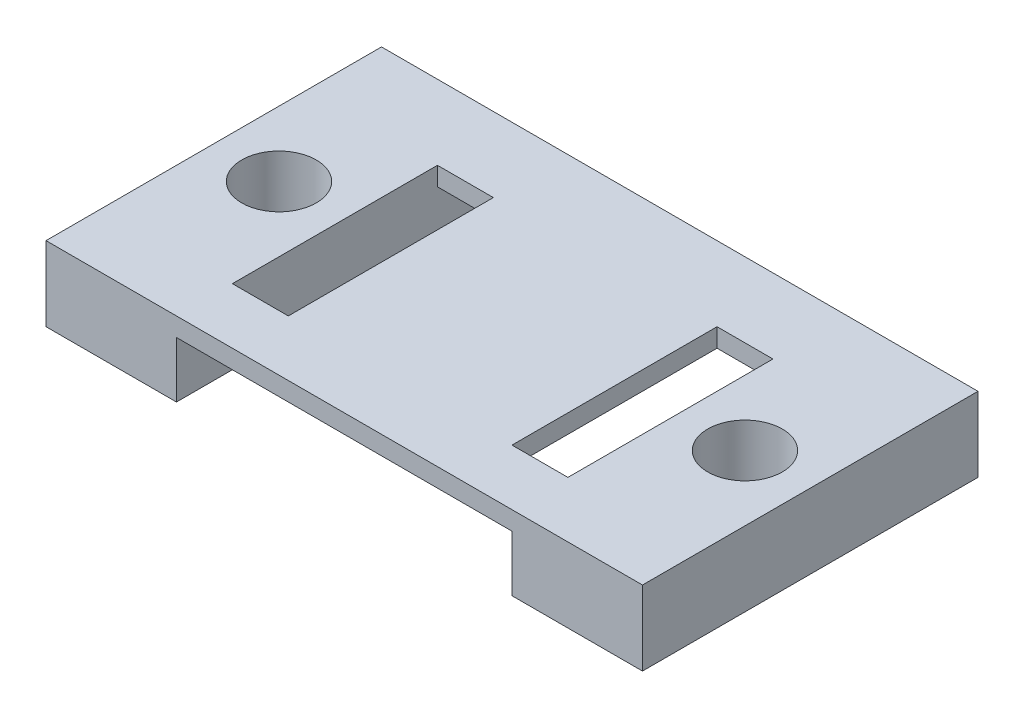
ISO-10303-21;
HEADER;
FILE_DESCRIPTION(('STEP AP214'),'2;1');
FILE_NAME('part.step','',(''),(''),'','','');
FILE_SCHEMA(('AUTOMOTIVE_DESIGN { 1 0 10303 214 1 1 1 1 }'));
ENDSEC;
DATA;
#1=APPLICATION_CONTEXT('core data for automotive mechanical design processes');
#2=APPLICATION_PROTOCOL_DEFINITION('international standard','automotive_design',2000,#1);
#3=PRODUCT_CONTEXT('',#1,'mechanical');
#4=PRODUCT('Part','Part','',(#3));
#5=PRODUCT_RELATED_PRODUCT_CATEGORY('part','',(#4));
#6=PRODUCT_DEFINITION_FORMATION('','',#4);
#7=PRODUCT_DEFINITION_CONTEXT('part definition',#1,'design');
#8=PRODUCT_DEFINITION('design','',#6,#7);
#9=PRODUCT_DEFINITION_SHAPE('','',#8);
#10=(LENGTH_UNIT() NAMED_UNIT(*) SI_UNIT(.MILLI.,.METRE.));
#11=(NAMED_UNIT(*) PLANE_ANGLE_UNIT() SI_UNIT($,.RADIAN.));
#12=(NAMED_UNIT(*) SI_UNIT($,.STERADIAN.) SOLID_ANGLE_UNIT());
#13=UNCERTAINTY_MEASURE_WITH_UNIT(LENGTH_MEASURE(1.E-05),#10,'distance_accuracy_value','');
#14=(GEOMETRIC_REPRESENTATION_CONTEXT(3) GLOBAL_UNCERTAINTY_ASSIGNED_CONTEXT((#13)) GLOBAL_UNIT_ASSIGNED_CONTEXT((#10,
#11,#12)) REPRESENTATION_CONTEXT('',''));
#15=CARTESIAN_POINT('',(0.,0.,0.));
#16=DIRECTION('',(0.,0.,1.));
#17=DIRECTION('',(1.,0.,0.));
#18=AXIS2_PLACEMENT_3D('',#15,#16,#17);
#19=CARTESIAN_POINT('',(-9.,1.,0.));
#20=DIRECTION('',(0.,0.,-1.));
#21=DIRECTION('',(-1.,0.,0.));
#22=AXIS2_PLACEMENT_3D('',#19,#20,#21);
#23=PLANE('',#22);
#24=DIRECTION('',(1.,0.,0.));
#25=VECTOR('',#24,1.);
#26=CARTESIAN_POINT('',(-9.,0.,0.));
#27=LINE('',#26,#25);
#28=CARTESIAN_POINT('',(-9.,0.,0.));
#29=VERTEX_POINT('',#28);
#30=CARTESIAN_POINT('',(9.,0.,0.));
#31=VERTEX_POINT('',#30);
#32=EDGE_CURVE('E149',#29,#31,#27,.T.);
#33=ORIENTED_EDGE('',*,*,#32,.T.);
#34=DIRECTION('',(0.,1.,0.));
#35=VECTOR('',#34,1.);
#36=CARTESIAN_POINT('',(9.,-3.,0.));
#37=LINE('',#36,#35);
#38=CARTESIAN_POINT('',(9.,-3.,0.));
#39=VERTEX_POINT('',#38);
#40=EDGE_CURVE('E289',#39,#31,#37,.T.);
#41=ORIENTED_EDGE('',*,*,#40,.F.);
#42=DIRECTION('',(1.,0.,0.));
#43=VECTOR('',#42,1.);
#44=CARTESIAN_POINT('',(9.,-3.,0.));
#45=LINE('',#44,#43);
#46=CARTESIAN_POINT('',(16.,-3.,0.));
#47=VERTEX_POINT('',#46);
#48=EDGE_CURVE('E285',#39,#47,#45,.T.);
#49=ORIENTED_EDGE('',*,*,#48,.T.);
#50=DIRECTION('',(0.,1.,0.));
#51=VECTOR('',#50,1.);
#52=CARTESIAN_POINT('',(16.,-3.,0.));
#53=LINE('',#52,#51);
#54=CARTESIAN_POINT('',(16.,1.,0.));
#55=VERTEX_POINT('',#54);
#56=EDGE_CURVE('E276',#47,#55,#53,.T.);
#57=ORIENTED_EDGE('',*,*,#56,.T.);
#58=DIRECTION('',(1.,0.,0.));
#59=VECTOR('',#58,1.);
#60=CARTESIAN_POINT('',(-9.,1.,0.));
#61=LINE('',#60,#59);
#62=CARTESIAN_POINT('',(-16.,1.,0.));
#63=VERTEX_POINT('',#62);
#64=EDGE_CURVE('E183',#63,#55,#61,.T.);
#65=ORIENTED_EDGE('',*,*,#64,.F.);
#66=DIRECTION('',(0.,1.,0.));
#67=VECTOR('',#66,1.);
#68=CARTESIAN_POINT('',(-16.,-3.,0.));
#69=LINE('',#68,#67);
#70=CARTESIAN_POINT('',(-16.,-3.,0.));
#71=VERTEX_POINT('',#70);
#72=EDGE_CURVE('E238',#71,#63,#69,.T.);
#73=ORIENTED_EDGE('',*,*,#72,.F.);
#74=DIRECTION('',(1.,0.,0.));
#75=VECTOR('',#74,1.);
#76=CARTESIAN_POINT('',(-9.,-3.,0.));
#77=LINE('',#76,#75);
#78=CARTESIAN_POINT('',(-9.,-3.,0.));
#79=VERTEX_POINT('',#78);
#80=EDGE_CURVE('E261',#71,#79,#77,.T.);
#81=ORIENTED_EDGE('',*,*,#80,.T.);
#82=DIRECTION('',(0.,1.,0.));
#83=VECTOR('',#82,1.);
#84=CARTESIAN_POINT('',(-9.,-3.,0.));
#85=LINE('',#84,#83);
#86=EDGE_CURVE('E243',#79,#29,#85,.T.);
#87=ORIENTED_EDGE('',*,*,#86,.T.);
#88=EDGE_LOOP('',(#33,#41,#49,#57,#65,#73,#81,#87));
#89=FACE_BOUND('',#88,.T.);
#90=ADVANCED_FACE('F39',(#89),#23,.F.);
#91=CARTESIAN_POINT('',(9.,1.,-3.));
#92=DIRECTION('',(0.,0.,1.));
#93=DIRECTION('',(1.,0.,0.));
#94=AXIS2_PLACEMENT_3D('',#91,#92,#93);
#95=PLANE('',#94);
#96=DIRECTION('',(-1.,0.,0.));
#97=VECTOR('',#96,1.);
#98=CARTESIAN_POINT('',(9.,0.,-3.));
#99=LINE('',#98,#97);
#100=CARTESIAN_POINT('',(9.,0.,-3.));
#101=VERTEX_POINT('',#100);
#102=CARTESIAN_POINT('',(6.,0.,-3.));
#103=VERTEX_POINT('',#102);
#104=EDGE_CURVE('E157',#101,#103,#99,.T.);
#105=ORIENTED_EDGE('',*,*,#104,.T.);
#106=DIRECTION('',(0.,-1.,0.));
#107=VECTOR('',#106,1.);
#108=CARTESIAN_POINT('',(6.,1.,-3.));
#109=LINE('',#108,#107);
#110=CARTESIAN_POINT('',(6.,1.,-3.));
#111=VERTEX_POINT('',#110);
#112=EDGE_CURVE('E48',#111,#103,#109,.T.);
#113=ORIENTED_EDGE('',*,*,#112,.F.);
#114=DIRECTION('',(-1.,0.,0.));
#115=VECTOR('',#114,1.);
#116=CARTESIAN_POINT('',(9.,1.,-3.));
#117=LINE('',#116,#115);
#118=CARTESIAN_POINT('',(9.,1.,-3.));
#119=VERTEX_POINT('',#118);
#120=EDGE_CURVE('E100',#119,#111,#117,.T.);
#121=ORIENTED_EDGE('',*,*,#120,.F.);
#122=DIRECTION('',(0.,-1.,0.));
#123=VECTOR('',#122,1.);
#124=CARTESIAN_POINT('',(9.,1.,-3.));
#125=LINE('',#124,#123);
#126=EDGE_CURVE('E11',#119,#101,#125,.T.);
#127=ORIENTED_EDGE('',*,*,#126,.T.);
#128=EDGE_LOOP('',(#105,#113,#121,#127));
#129=FACE_BOUND('',#128,.T.);
#130=ADVANCED_FACE('F351',(#129),#95,.F.);
#131=CARTESIAN_POINT('',(6.,1.,-3.));
#132=DIRECTION('',(-1.,0.,0.));
#133=DIRECTION('',(0.,0.,1.));
#134=AXIS2_PLACEMENT_3D('',#131,#132,#133);
#135=PLANE('',#134);
#136=DIRECTION('',(0.,0.,-1.));
#137=VECTOR('',#136,1.);
#138=CARTESIAN_POINT('',(6.,0.,-3.));
#139=LINE('',#138,#137);
#140=CARTESIAN_POINT('',(6.,0.,-14.));
#141=VERTEX_POINT('',#140);
#142=EDGE_CURVE('E160',#103,#141,#139,.T.);
#143=ORIENTED_EDGE('',*,*,#142,.T.);
#144=DIRECTION('',(0.,-1.,0.));
#145=VECTOR('',#144,1.);
#146=CARTESIAN_POINT('',(6.,1.,-14.));
#147=LINE('',#146,#145);
#148=CARTESIAN_POINT('',(6.,1.,-14.));
#149=VERTEX_POINT('',#148);
#150=EDGE_CURVE('E195',#149,#141,#147,.T.);
#151=ORIENTED_EDGE('',*,*,#150,.F.);
#152=DIRECTION('',(0.,0.,-1.));
#153=VECTOR('',#152,1.);
#154=CARTESIAN_POINT('',(6.,1.,-3.));
#155=LINE('',#154,#153);
#156=EDGE_CURVE('E205',#111,#149,#155,.T.);
#157=ORIENTED_EDGE('',*,*,#156,.F.);
#158=ORIENTED_EDGE('',*,*,#112,.T.);
#159=EDGE_LOOP('',(#143,#151,#157,#158));
#160=FACE_BOUND('',#159,.T.);
#161=ADVANCED_FACE('F203',(#160),#135,.F.);
#162=CARTESIAN_POINT('',(6.,1.,-14.));
#163=DIRECTION('',(0.,0.,-1.));
#164=DIRECTION('',(-1.,0.,0.));
#165=AXIS2_PLACEMENT_3D('',#162,#163,#164);
#166=PLANE('',#165);
#167=DIRECTION('',(1.,0.,0.));
#168=VECTOR('',#167,1.);
#169=CARTESIAN_POINT('',(6.,0.,-14.));
#170=LINE('',#169,#168);
#171=CARTESIAN_POINT('',(9.,0.,-14.));
#172=VERTEX_POINT('',#171);
#173=EDGE_CURVE('E163',#141,#172,#170,.T.);
#174=ORIENTED_EDGE('',*,*,#173,.T.);
#175=DIRECTION('',(0.,-1.,0.));
#176=VECTOR('',#175,1.);
#177=CARTESIAN_POINT('',(9.,1.,-14.));
#178=LINE('',#177,#176);
#179=CARTESIAN_POINT('',(9.,1.,-14.));
#180=VERTEX_POINT('',#179);
#181=EDGE_CURVE('E191',#180,#172,#178,.T.);
#182=ORIENTED_EDGE('',*,*,#181,.F.);
#183=DIRECTION('',(1.,0.,0.));
#184=VECTOR('',#183,1.);
#185=CARTESIAN_POINT('',(6.,1.,-14.));
#186=LINE('',#185,#184);
#187=EDGE_CURVE('E219',#149,#180,#186,.T.);
#188=ORIENTED_EDGE('',*,*,#187,.F.);
#189=ORIENTED_EDGE('',*,*,#150,.T.);
#190=EDGE_LOOP('',(#174,#182,#188,#189));
#191=FACE_BOUND('',#190,.T.);
#192=ADVANCED_FACE('F216',(#191),#166,.F.);
#193=CARTESIAN_POINT('',(9.,1.,-18.));
#194=DIRECTION('',(0.,0.,1.));
#195=DIRECTION('',(1.,0.,0.));
#196=AXIS2_PLACEMENT_3D('',#193,#194,#195);
#197=PLANE('',#196);
#198=DIRECTION('',(-1.,0.,0.));
#199=VECTOR('',#198,1.);
#200=CARTESIAN_POINT('',(9.,0.,-18.));
#201=LINE('',#200,#199);
#202=CARTESIAN_POINT('',(9.,0.,-18.));
#203=VERTEX_POINT('',#202);
#204=CARTESIAN_POINT('',(-9.,0.,-18.));
#205=VERTEX_POINT('',#204);
#206=EDGE_CURVE('E170',#203,#205,#201,.T.);
#207=ORIENTED_EDGE('',*,*,#206,.T.);
#208=DIRECTION('',(0.,1.,0.));
#209=VECTOR('',#208,1.);
#210=CARTESIAN_POINT('',(-9.,-3.,-18.));
#211=LINE('',#210,#209);
#212=CARTESIAN_POINT('',(-9.,-3.,-18.));
#213=VERTEX_POINT('',#212);
#214=EDGE_CURVE('E150',#213,#205,#211,.T.);
#215=ORIENTED_EDGE('',*,*,#214,.F.);
#216=DIRECTION('',(-1.,0.,0.));
#217=VECTOR('',#216,1.);
#218=CARTESIAN_POINT('',(-16.,-3.,-18.));
#219=LINE('',#218,#217);
#220=CARTESIAN_POINT('',(-16.,-3.,-18.));
#221=VERTEX_POINT('',#220);
#222=EDGE_CURVE('E252',#213,#221,#219,.T.);
#223=ORIENTED_EDGE('',*,*,#222,.T.);
#224=DIRECTION('',(0.,1.,0.));
#225=VECTOR('',#224,1.);
#226=CARTESIAN_POINT('',(-16.,-3.,-18.));
#227=LINE('',#226,#225);
#228=CARTESIAN_POINT('',(-16.,1.,-18.));
#229=VERTEX_POINT('',#228);
#230=EDGE_CURVE('E234',#221,#229,#227,.T.);
#231=ORIENTED_EDGE('',*,*,#230,.T.);
#232=DIRECTION('',(-1.,0.,0.));
#233=VECTOR('',#232,1.);
#234=CARTESIAN_POINT('',(9.,1.,-18.));
#235=LINE('',#234,#233);
#236=CARTESIAN_POINT('',(16.,1.,-18.));
#237=VERTEX_POINT('',#236);
#238=EDGE_CURVE('E127',#237,#229,#235,.T.);
#239=ORIENTED_EDGE('',*,*,#238,.F.);
#240=DIRECTION('',(0.,1.,0.));
#241=VECTOR('',#240,1.);
#242=CARTESIAN_POINT('',(16.,-3.,-18.));
#243=LINE('',#242,#241);
#244=CARTESIAN_POINT('',(16.,-3.,-18.));
#245=VERTEX_POINT('',#244);
#246=EDGE_CURVE('E280',#245,#237,#243,.T.);
#247=ORIENTED_EDGE('',*,*,#246,.F.);
#248=DIRECTION('',(-1.,0.,0.));
#249=VECTOR('',#248,1.);
#250=CARTESIAN_POINT('',(16.,-3.,-18.));
#251=LINE('',#250,#249);
#252=CARTESIAN_POINT('',(9.,-3.,-18.));
#253=VERTEX_POINT('',#252);
#254=EDGE_CURVE('E312',#245,#253,#251,.T.);
#255=ORIENTED_EDGE('',*,*,#254,.T.);
#256=DIRECTION('',(0.,1.,0.));
#257=VECTOR('',#256,1.);
#258=CARTESIAN_POINT('',(9.,-3.,-18.));
#259=LINE('',#258,#257);
#260=EDGE_CURVE('E284',#253,#203,#259,.T.);
#261=ORIENTED_EDGE('',*,*,#260,.T.);
#262=EDGE_LOOP('',(#207,#215,#223,#231,#239,#247,#255,#261));
#263=FACE_BOUND('',#262,.T.);
#264=ADVANCED_FACE('F407',(#263),#197,.F.);
#265=CARTESIAN_POINT('',(-9.,1.,-14.));
#266=DIRECTION('',(0.,0.,-1.));
#267=DIRECTION('',(-1.,0.,0.));
#268=AXIS2_PLACEMENT_3D('',#265,#266,#267);
#269=PLANE('',#268);
#270=DIRECTION('',(1.,0.,0.));
#271=VECTOR('',#270,1.);
#272=CARTESIAN_POINT('',(-9.,0.,-14.));
#273=LINE('',#272,#271);
#274=CARTESIAN_POINT('',(-9.,0.,-14.));
#275=VERTEX_POINT('',#274);
#276=CARTESIAN_POINT('',(-6.,0.,-14.));
#277=VERTEX_POINT('',#276);
#278=EDGE_CURVE('E132',#275,#277,#273,.T.);
#279=ORIENTED_EDGE('',*,*,#278,.T.);
#280=DIRECTION('',(0.,-1.,0.));
#281=VECTOR('',#280,1.);
#282=CARTESIAN_POINT('',(-6.,1.,-14.));
#283=LINE('',#282,#281);
#284=CARTESIAN_POINT('',(-6.,1.,-14.));
#285=VERTEX_POINT('',#284);
#286=EDGE_CURVE('E129',#285,#277,#283,.T.);
#287=ORIENTED_EDGE('',*,*,#286,.F.);
#288=DIRECTION('',(1.,0.,0.));
#289=VECTOR('',#288,1.);
#290=CARTESIAN_POINT('',(-9.,1.,-14.));
#291=LINE('',#290,#289);
#292=CARTESIAN_POINT('',(-9.,1.,-14.));
#293=VERTEX_POINT('',#292);
#294=EDGE_CURVE('E115',#293,#285,#291,.T.);
#295=ORIENTED_EDGE('',*,*,#294,.F.);
#296=DIRECTION('',(0.,-1.,0.));
#297=VECTOR('',#296,1.);
#298=CARTESIAN_POINT('',(-9.,1.,-14.));
#299=LINE('',#298,#297);
#300=EDGE_CURVE('E134',#293,#275,#299,.T.);
#301=ORIENTED_EDGE('',*,*,#300,.T.);
#302=EDGE_LOOP('',(#279,#287,#295,#301));
#303=FACE_BOUND('',#302,.T.);
#304=ADVANCED_FACE('F130',(#303),#269,.F.);
#305=CARTESIAN_POINT('',(-6.,1.,-14.));
#306=DIRECTION('',(1.,0.,0.));
#307=DIRECTION('',(0.,0.,-1.));
#308=AXIS2_PLACEMENT_3D('',#305,#306,#307);
#309=PLANE('',#308);
#310=DIRECTION('',(0.,0.,1.));
#311=VECTOR('',#310,1.);
#312=CARTESIAN_POINT('',(-6.,0.,-14.));
#313=LINE('',#312,#311);
#314=CARTESIAN_POINT('',(-6.,0.,-3.));
#315=VERTEX_POINT('',#314);
#316=EDGE_CURVE('E86',#277,#315,#313,.T.);
#317=ORIENTED_EDGE('',*,*,#316,.T.);
#318=DIRECTION('',(0.,-1.,0.));
#319=VECTOR('',#318,1.);
#320=CARTESIAN_POINT('',(-6.,1.,-3.));
#321=LINE('',#320,#319);
#322=CARTESIAN_POINT('',(-6.,1.,-3.));
#323=VERTEX_POINT('',#322);
#324=EDGE_CURVE('E135',#323,#315,#321,.T.);
#325=ORIENTED_EDGE('',*,*,#324,.F.);
#326=DIRECTION('',(0.,0.,1.));
#327=VECTOR('',#326,1.);
#328=CARTESIAN_POINT('',(-6.,1.,-14.));
#329=LINE('',#328,#327);
#330=EDGE_CURVE('E120',#285,#323,#329,.T.);
#331=ORIENTED_EDGE('',*,*,#330,.F.);
#332=ORIENTED_EDGE('',*,*,#286,.T.);
#333=EDGE_LOOP('',(#317,#325,#331,#332));
#334=FACE_BOUND('',#333,.T.);
#335=ADVANCED_FACE('F137',(#334),#309,.F.);
#336=CARTESIAN_POINT('',(-6.,1.,-3.));
#337=DIRECTION('',(0.,0.,1.));
#338=DIRECTION('',(1.,0.,0.));
#339=AXIS2_PLACEMENT_3D('',#336,#337,#338);
#340=PLANE('',#339);
#341=DIRECTION('',(-1.,0.,0.));
#342=VECTOR('',#341,1.);
#343=CARTESIAN_POINT('',(-6.,0.,-3.));
#344=LINE('',#343,#342);
#345=CARTESIAN_POINT('',(-9.,0.,-3.));
#346=VERTEX_POINT('',#345);
#347=EDGE_CURVE('E92',#315,#346,#344,.T.);
#348=ORIENTED_EDGE('',*,*,#347,.T.);
#349=DIRECTION('',(0.,-1.,0.));
#350=VECTOR('',#349,1.);
#351=CARTESIAN_POINT('',(-9.,1.,-3.));
#352=LINE('',#351,#350);
#353=CARTESIAN_POINT('',(-9.,1.,-3.));
#354=VERTEX_POINT('',#353);
#355=EDGE_CURVE('E141',#354,#346,#352,.T.);
#356=ORIENTED_EDGE('',*,*,#355,.F.);
#357=DIRECTION('',(-1.,0.,0.));
#358=VECTOR('',#357,1.);
#359=CARTESIAN_POINT('',(-6.,1.,-3.));
#360=LINE('',#359,#358);
#361=EDGE_CURVE('E56',#323,#354,#360,.T.);
#362=ORIENTED_EDGE('',*,*,#361,.F.);
#363=ORIENTED_EDGE('',*,*,#324,.T.);
#364=EDGE_LOOP('',(#348,#356,#362,#363));
#365=FACE_BOUND('',#364,.T.);
#366=ADVANCED_FACE('F337',(#365),#340,.F.);
#367=CARTESIAN_POINT('',(0.,1.,0.));
#368=DIRECTION('',(0.,1.,0.));
#369=DIRECTION('',(0.,0.,1.));
#370=AXIS2_PLACEMENT_3D('',#367,#368,#369);
#371=PLANE('',#370);
#372=DIRECTION('',(0.,0.,-1.));
#373=VECTOR('',#372,1.);
#374=CARTESIAN_POINT('',(16.,1.,0.));
#375=LINE('',#374,#373);
#376=EDGE_CURVE('E300',#55,#237,#375,.T.);
#377=ORIENTED_EDGE('',*,*,#376,.T.);
#378=ORIENTED_EDGE('',*,*,#238,.T.);
#379=DIRECTION('',(0.,0.,1.));
#380=VECTOR('',#379,1.);
#381=CARTESIAN_POINT('',(-16.,1.,0.));
#382=LINE('',#381,#380);
#383=EDGE_CURVE('E253',#229,#63,#382,.T.);
#384=ORIENTED_EDGE('',*,*,#383,.T.);
#385=ORIENTED_EDGE('',*,*,#64,.T.);
#386=EDGE_LOOP('',(#377,#378,#384,#385));
#387=FACE_BOUND('',#386,.T.);
#388=ORIENTED_EDGE('',*,*,#187,.T.);
#389=DIRECTION('',(0.,0.,1.));
#390=VECTOR('',#389,1.);
#391=CARTESIAN_POINT('',(9.,1.,-18.));
#392=LINE('',#391,#390);
#393=EDGE_CURVE('E296',#180,#119,#392,.T.);
#394=ORIENTED_EDGE('',*,*,#393,.T.);
#395=ORIENTED_EDGE('',*,*,#120,.T.);
#396=ORIENTED_EDGE('',*,*,#156,.T.);
#397=EDGE_LOOP('',(#388,#394,#395,#396));
#398=FACE_BOUND('',#397,.T.);
#399=ORIENTED_EDGE('',*,*,#361,.T.);
#400=DIRECTION('',(0.,0.,-1.));
#401=VECTOR('',#400,1.);
#402=CARTESIAN_POINT('',(-9.,1.,-18.));
#403=LINE('',#402,#401);
#404=EDGE_CURVE('E122',#354,#293,#403,.T.);
#405=ORIENTED_EDGE('',*,*,#404,.T.);
#406=ORIENTED_EDGE('',*,*,#294,.T.);
#407=ORIENTED_EDGE('',*,*,#330,.T.);
#408=EDGE_LOOP('',(#399,#405,#406,#407));
#409=FACE_BOUND('',#408,.T.);
#410=CARTESIAN_POINT('',(-12.5,1.,-8.99999999999999));
#411=DIRECTION('',(0.,1.,0.));
#412=DIRECTION('',(0.,0.,1.));
#413=AXIS2_PLACEMENT_3D('',#410,#411,#412);
#414=CIRCLE('',#413,2.);
#415=CARTESIAN_POINT('',(-12.5,1.,-6.99999999999999));
#416=VERTEX_POINT('',#415);
#417=EDGE_CURVE('E272',#416,#416,#414,.T.);
#418=ORIENTED_EDGE('',*,*,#417,.F.);
#419=EDGE_LOOP('',(#418));
#420=FACE_BOUND('',#419,.T.);
#421=CARTESIAN_POINT('',(12.5,1.,-8.99999999999999));
#422=DIRECTION('',(0.,1.,0.));
#423=DIRECTION('',(0.,0.,-1.));
#424=AXIS2_PLACEMENT_3D('',#421,#422,#423);
#425=CIRCLE('',#424,2.);
#426=CARTESIAN_POINT('',(12.5,1.,-11.));
#427=VERTEX_POINT('',#426);
#428=EDGE_CURVE('E319',#427,#427,#425,.T.);
#429=ORIENTED_EDGE('',*,*,#428,.F.);
#430=EDGE_LOOP('',(#429));
#431=FACE_BOUND('',#430,.T.);
#432=ADVANCED_FACE('F117',(#387,#398,#409,#420,#431),#371,.T.);
#433=CARTESIAN_POINT('',(0.,0.,0.));
#434=DIRECTION('',(0.,1.,0.));
#435=DIRECTION('',(0.,0.,1.));
#436=AXIS2_PLACEMENT_3D('',#433,#434,#435);
#437=PLANE('',#436);
#438=DIRECTION('',(0.,0.,1.));
#439=VECTOR('',#438,1.);
#440=CARTESIAN_POINT('',(-9.,0.,-3.));
#441=LINE('',#440,#439);
#442=EDGE_CURVE('E145',#346,#29,#441,.T.);
#443=ORIENTED_EDGE('',*,*,#442,.F.);
#444=ORIENTED_EDGE('',*,*,#347,.F.);
#445=ORIENTED_EDGE('',*,*,#316,.F.);
#446=ORIENTED_EDGE('',*,*,#278,.F.);
#447=DIRECTION('',(0.,0.,1.));
#448=VECTOR('',#447,1.);
#449=CARTESIAN_POINT('',(-9.,0.,-18.));
#450=LINE('',#449,#448);
#451=EDGE_CURVE('E173',#205,#275,#450,.T.);
#452=ORIENTED_EDGE('',*,*,#451,.F.);
#453=ORIENTED_EDGE('',*,*,#206,.F.);
#454=DIRECTION('',(0.,0.,-1.));
#455=VECTOR('',#454,1.);
#456=CARTESIAN_POINT('',(9.,0.,-14.));
#457=LINE('',#456,#455);
#458=EDGE_CURVE('E166',#172,#203,#457,.T.);
#459=ORIENTED_EDGE('',*,*,#458,.F.);
#460=ORIENTED_EDGE('',*,*,#173,.F.);
#461=ORIENTED_EDGE('',*,*,#142,.F.);
#462=ORIENTED_EDGE('',*,*,#104,.F.);
#463=DIRECTION('',(0.,0.,-1.));
#464=VECTOR('',#463,1.);
#465=CARTESIAN_POINT('',(9.,0.,0.));
#466=LINE('',#465,#464);
#467=EDGE_CURVE('E153',#31,#101,#466,.T.);
#468=ORIENTED_EDGE('',*,*,#467,.F.);
#469=ORIENTED_EDGE('',*,*,#32,.F.);
#470=EDGE_LOOP('',(#443,#444,#445,#446,#452,#453,#459,#460,#461,#462,#468,#469));
#471=FACE_BOUND('',#470,.T.);
#472=ADVANCED_FACE('F209',(#471),#437,.F.);
#473=CARTESIAN_POINT('',(-9.,-3.,-18.));
#474=DIRECTION('',(1.,0.,0.));
#475=DIRECTION('',(0.,0.,-1.));
#476=AXIS2_PLACEMENT_3D('',#473,#474,#475);
#477=PLANE('',#476);
#478=ORIENTED_EDGE('',*,*,#355,.T.);
#479=ORIENTED_EDGE('',*,*,#442,.T.);
#480=ORIENTED_EDGE('',*,*,#86,.F.);
#481=DIRECTION('',(0.,0.,-1.));
#482=VECTOR('',#481,1.);
#483=CARTESIAN_POINT('',(-9.,-3.,-18.));
#484=LINE('',#483,#482);
#485=EDGE_CURVE('E239',#79,#213,#484,.T.);
#486=ORIENTED_EDGE('',*,*,#485,.T.);
#487=ORIENTED_EDGE('',*,*,#214,.T.);
#488=ORIENTED_EDGE('',*,*,#451,.T.);
#489=ORIENTED_EDGE('',*,*,#300,.F.);
#490=ORIENTED_EDGE('',*,*,#404,.F.);
#491=EDGE_LOOP('',(#478,#479,#480,#486,#487,#488,#489,#490));
#492=FACE_BOUND('',#491,.T.);
#493=ADVANCED_FACE('F345',(#492),#477,.T.);
#494=CARTESIAN_POINT('',(-16.,-3.,0.));
#495=DIRECTION('',(-1.,0.,0.));
#496=DIRECTION('',(0.,0.,1.));
#497=AXIS2_PLACEMENT_3D('',#494,#495,#496);
#498=PLANE('',#497);
#499=ORIENTED_EDGE('',*,*,#383,.F.);
#500=ORIENTED_EDGE('',*,*,#230,.F.);
#501=DIRECTION('',(0.,0.,1.));
#502=VECTOR('',#501,1.);
#503=CARTESIAN_POINT('',(-16.,-3.,0.));
#504=LINE('',#503,#502);
#505=EDGE_CURVE('E265',#221,#71,#504,.T.);
#506=ORIENTED_EDGE('',*,*,#505,.T.);
#507=ORIENTED_EDGE('',*,*,#72,.T.);
#508=EDGE_LOOP('',(#499,#500,#506,#507));
#509=FACE_BOUND('',#508,.T.);
#510=ADVANCED_FACE('F414',(#509),#498,.T.);
#511=CARTESIAN_POINT('',(0.,-3.,0.));
#512=DIRECTION('',(0.,-1.,0.));
#513=DIRECTION('',(0.,0.,-1.));
#514=AXIS2_PLACEMENT_3D('',#511,#512,#513);
#515=PLANE('',#514);
#516=CARTESIAN_POINT('',(-12.5,-3.,-8.99999999999999));
#517=DIRECTION('',(0.,1.,0.));
#518=DIRECTION('',(0.,0.,1.));
#519=AXIS2_PLACEMENT_3D('',#516,#517,#518);
#520=CIRCLE('',#519,2.);
#521=CARTESIAN_POINT('',(-12.5,-3.,-6.99999999999999));
#522=VERTEX_POINT('',#521);
#523=EDGE_CURVE('E257',#522,#522,#520,.T.);
#524=ORIENTED_EDGE('',*,*,#523,.T.);
#525=EDGE_LOOP('',(#524));
#526=FACE_BOUND('',#525,.T.);
#527=ORIENTED_EDGE('',*,*,#222,.F.);
#528=ORIENTED_EDGE('',*,*,#485,.F.);
#529=ORIENTED_EDGE('',*,*,#80,.F.);
#530=ORIENTED_EDGE('',*,*,#505,.F.);
#531=EDGE_LOOP('',(#527,#528,#529,#530));
#532=FACE_BOUND('',#531,.T.);
#533=ADVANCED_FACE('F410',(#526,#532),#515,.T.);
#534=CARTESIAN_POINT('',(-12.5,-3.,-8.99999999999999));
#535=DIRECTION('',(0.,1.,0.));
#536=DIRECTION('',(0.,0.,1.));
#537=AXIS2_PLACEMENT_3D('',#534,#535,#536);
#538=CYLINDRICAL_SURFACE('',#537,2.);
#539=ORIENTED_EDGE('',*,*,#523,.F.);
#540=EDGE_LOOP('',(#539));
#541=FACE_BOUND('',#540,.T.);
#542=ORIENTED_EDGE('',*,*,#417,.T.);
#543=EDGE_LOOP('',(#542));
#544=FACE_BOUND('',#543,.T.);
#545=ADVANCED_FACE('F425',(#541,#544),#538,.F.);
#546=CARTESIAN_POINT('',(9.,-3.,-18.));
#547=DIRECTION('',(-1.,0.,0.));
#548=DIRECTION('',(0.,0.,1.));
#549=AXIS2_PLACEMENT_3D('',#546,#547,#548);
#550=PLANE('',#549);
#551=ORIENTED_EDGE('',*,*,#181,.T.);
#552=ORIENTED_EDGE('',*,*,#458,.T.);
#553=ORIENTED_EDGE('',*,*,#260,.F.);
#554=DIRECTION('',(0.,0.,1.));
#555=VECTOR('',#554,1.);
#556=CARTESIAN_POINT('',(9.,-3.,-18.));
#557=LINE('',#556,#555);
#558=EDGE_CURVE('E308',#253,#39,#557,.T.);
#559=ORIENTED_EDGE('',*,*,#558,.T.);
#560=ORIENTED_EDGE('',*,*,#40,.T.);
#561=ORIENTED_EDGE('',*,*,#467,.T.);
#562=ORIENTED_EDGE('',*,*,#126,.F.);
#563=ORIENTED_EDGE('',*,*,#393,.F.);
#564=EDGE_LOOP('',(#551,#552,#553,#559,#560,#561,#562,#563));
#565=FACE_BOUND('',#564,.T.);
#566=ADVANCED_FACE('F363',(#565),#550,.T.);
#567=CARTESIAN_POINT('',(16.,-3.,0.));
#568=DIRECTION('',(1.,0.,0.));
#569=DIRECTION('',(0.,0.,-1.));
#570=AXIS2_PLACEMENT_3D('',#567,#568,#569);
#571=PLANE('',#570);
#572=ORIENTED_EDGE('',*,*,#376,.F.);
#573=ORIENTED_EDGE('',*,*,#56,.F.);
#574=DIRECTION('',(0.,0.,-1.));
#575=VECTOR('',#574,1.);
#576=CARTESIAN_POINT('',(16.,-3.,0.));
#577=LINE('',#576,#575);
#578=EDGE_CURVE('E299',#47,#245,#577,.T.);
#579=ORIENTED_EDGE('',*,*,#578,.T.);
#580=ORIENTED_EDGE('',*,*,#246,.T.);
#581=EDGE_LOOP('',(#572,#573,#579,#580));
#582=FACE_BOUND('',#581,.T.);
#583=ADVANCED_FACE('F416',(#582),#571,.T.);
#584=CARTESIAN_POINT('',(0.,-3.,0.));
#585=DIRECTION('',(0.,1.,0.));
#586=DIRECTION('',(0.,0.,1.));
#587=AXIS2_PLACEMENT_3D('',#584,#585,#586);
#588=PLANE('',#587);
#589=CARTESIAN_POINT('',(12.5,-3.,-8.99999999999999));
#590=DIRECTION('',(0.,1.,0.));
#591=DIRECTION('',(0.,0.,-1.));
#592=AXIS2_PLACEMENT_3D('',#589,#590,#591);
#593=CIRCLE('',#592,2.);
#594=CARTESIAN_POINT('',(12.5,-3.,-11.));
#595=VERTEX_POINT('',#594);
#596=EDGE_CURVE('E304',#595,#595,#593,.T.);
#597=ORIENTED_EDGE('',*,*,#596,.T.);
#598=EDGE_LOOP('',(#597));
#599=FACE_BOUND('',#598,.T.);
#600=ORIENTED_EDGE('',*,*,#578,.F.);
#601=ORIENTED_EDGE('',*,*,#48,.F.);
#602=ORIENTED_EDGE('',*,*,#558,.F.);
#603=ORIENTED_EDGE('',*,*,#254,.F.);
#604=EDGE_LOOP('',(#600,#601,#602,#603));
#605=FACE_BOUND('',#604,.T.);
#606=ADVANCED_FACE('F327',(#599,#605),#588,.F.);
#607=CARTESIAN_POINT('',(12.5,-3.,-8.99999999999999));
#608=DIRECTION('',(0.,1.,0.));
#609=DIRECTION('',(0.,0.,1.));
#610=AXIS2_PLACEMENT_3D('',#607,#608,#609);
#611=CYLINDRICAL_SURFACE('',#610,2.);
#612=ORIENTED_EDGE('',*,*,#596,.F.);
#613=EDGE_LOOP('',(#612));
#614=FACE_BOUND('',#613,.T.);
#615=ORIENTED_EDGE('',*,*,#428,.T.);
#616=EDGE_LOOP('',(#615));
#617=FACE_BOUND('',#616,.T.);
#618=ADVANCED_FACE('F330',(#614,#617),#611,.F.);
#619=CLOSED_SHELL('',(#90,#130,#161,#192,#264,#304,#335,#366,#432,#472,#493,#510,#533,#545,#566,
#583,#606,#618));
#620=MANIFOLD_SOLID_BREP('B2',#619);
#621=ADVANCED_BREP_SHAPE_REPRESENTATION('',(#18,#620),#14);
#622=SHAPE_DEFINITION_REPRESENTATION(#9,#621);
ENDSEC;
END-ISO-10303-21;
